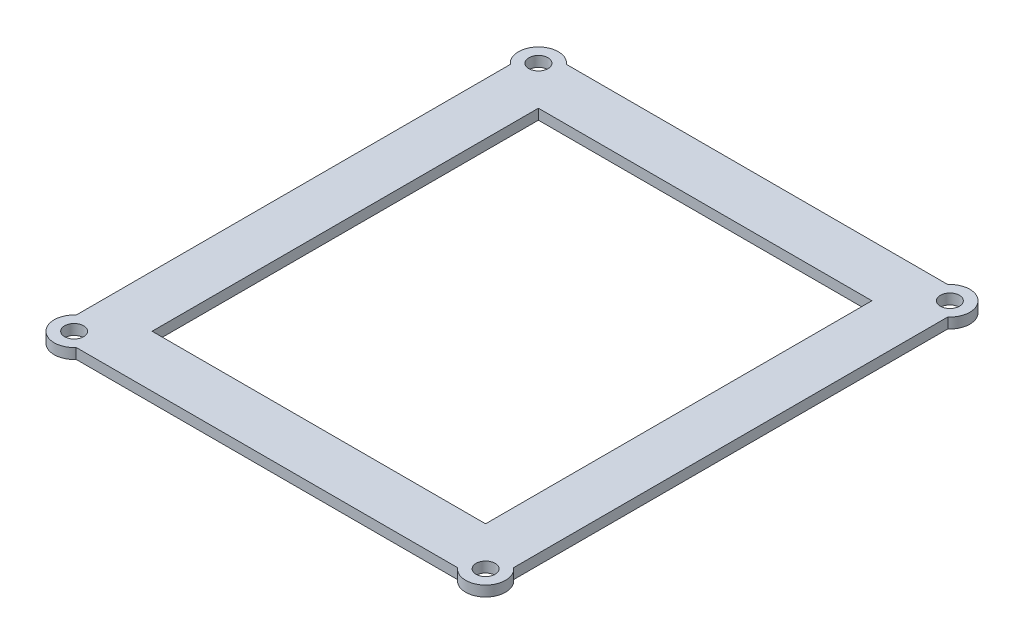
ISO-10303-21;
HEADER;
FILE_DESCRIPTION(('STEP AP214'),'2;1');
FILE_NAME('part.step','',(''),(''),'','','');
FILE_SCHEMA(('AUTOMOTIVE_DESIGN { 1 0 10303 214 1 1 1 1 }'));
ENDSEC;
DATA;
#1=APPLICATION_CONTEXT('core data for automotive mechanical design processes');
#2=APPLICATION_PROTOCOL_DEFINITION('international standard','automotive_design',2000,#1);
#3=PRODUCT_CONTEXT('',#1,'mechanical');
#4=PRODUCT('Part','Part','',(#3));
#5=PRODUCT_RELATED_PRODUCT_CATEGORY('part','',(#4));
#6=PRODUCT_DEFINITION_FORMATION('','',#4);
#7=PRODUCT_DEFINITION_CONTEXT('part definition',#1,'design');
#8=PRODUCT_DEFINITION('design','',#6,#7);
#9=PRODUCT_DEFINITION_SHAPE('','',#8);
#10=(LENGTH_UNIT() NAMED_UNIT(*) SI_UNIT(.MILLI.,.METRE.));
#11=(NAMED_UNIT(*) PLANE_ANGLE_UNIT() SI_UNIT($,.RADIAN.));
#12=(NAMED_UNIT(*) SI_UNIT($,.STERADIAN.) SOLID_ANGLE_UNIT());
#13=UNCERTAINTY_MEASURE_WITH_UNIT(LENGTH_MEASURE(1.E-05),#10,'distance_accuracy_value','');
#14=(GEOMETRIC_REPRESENTATION_CONTEXT(3) GLOBAL_UNCERTAINTY_ASSIGNED_CONTEXT((#13)) GLOBAL_UNIT_ASSIGNED_CONTEXT((#10,
#11,#12)) REPRESENTATION_CONTEXT('',''));
#15=CARTESIAN_POINT('',(0.,0.,0.));
#16=DIRECTION('',(0.,0.,1.));
#17=DIRECTION('',(1.,0.,0.));
#18=AXIS2_PLACEMENT_3D('',#15,#16,#17);
#19=CARTESIAN_POINT('',(0.,3.048,0.));
#20=DIRECTION('',(0.,-1.,0.));
#21=DIRECTION('',(0.,0.,-1.));
#22=AXIS2_PLACEMENT_3D('',#19,#20,#21);
#23=PLANE('',#22);
#24=DIRECTION('',(0.,0.,1.));
#25=VECTOR('',#24,1.);
#26=CARTESIAN_POINT('',(0.,3.048,0.));
#27=LINE('',#26,#25);
#28=CARTESIAN_POINT('',(0.,3.048,-135.525358673363));
#29=VERTEX_POINT('',#28);
#30=CARTESIAN_POINT('',(0.,3.048,-8.23864132663734));
#31=VERTEX_POINT('',#30);
#32=EDGE_CURVE('E130',#29,#31,#27,.T.);
#33=ORIENTED_EDGE('',*,*,#32,.T.);
#34=CARTESIAN_POINT('',(3.81,3.048,-3.81000000000001));
#35=DIRECTION('',(0.,1.,0.));
#36=DIRECTION('',(0.,0.,1.));
#37=AXIS2_PLACEMENT_3D('',#34,#35,#36);
#38=CIRCLE('',#37,5.842);
#39=CARTESIAN_POINT('',(8.23864132663732,3.048,0.));
#40=VERTEX_POINT('',#39);
#41=EDGE_CURVE('E48',#31,#40,#38,.T.);
#42=ORIENTED_EDGE('',*,*,#41,.T.);
#43=DIRECTION('',(1.,0.,0.));
#44=VECTOR('',#43,1.);
#45=CARTESIAN_POINT('',(0.,3.048,0.));
#46=LINE('',#45,#44);
#47=CARTESIAN_POINT('',(120.031358673363,3.048,0.));
#48=VERTEX_POINT('',#47);
#49=EDGE_CURVE('E138',#40,#48,#46,.T.);
#50=ORIENTED_EDGE('',*,*,#49,.T.);
#51=CARTESIAN_POINT('',(124.46,3.048,-3.81));
#52=DIRECTION('',(0.,1.,0.));
#53=DIRECTION('',(0.,0.,1.));
#54=AXIS2_PLACEMENT_3D('',#51,#52,#53);
#55=CIRCLE('',#54,5.84200000000001);
#56=CARTESIAN_POINT('',(128.27,3.048,-8.23864132663734));
#57=VERTEX_POINT('',#56);
#58=EDGE_CURVE('E54',#48,#57,#55,.T.);
#59=ORIENTED_EDGE('',*,*,#58,.T.);
#60=DIRECTION('',(0.,0.,-1.));
#61=VECTOR('',#60,1.);
#62=CARTESIAN_POINT('',(128.27,3.048,0.));
#63=LINE('',#62,#61);
#64=CARTESIAN_POINT('',(128.27,3.048,-135.525358673363));
#65=VERTEX_POINT('',#64);
#66=EDGE_CURVE('E141',#57,#65,#63,.T.);
#67=ORIENTED_EDGE('',*,*,#66,.T.);
#68=CARTESIAN_POINT('',(124.46,3.048,-139.954));
#69=DIRECTION('',(0.,1.,0.));
#70=DIRECTION('',(0.,0.,1.));
#71=AXIS2_PLACEMENT_3D('',#68,#69,#70);
#72=CIRCLE('',#71,5.84200000000001);
#73=CARTESIAN_POINT('',(120.031358673363,3.048,-143.764));
#74=VERTEX_POINT('',#73);
#75=EDGE_CURVE('E196',#65,#74,#72,.T.);
#76=ORIENTED_EDGE('',*,*,#75,.T.);
#77=DIRECTION('',(-1.,0.,0.));
#78=VECTOR('',#77,1.);
#79=CARTESIAN_POINT('',(0.,3.048,-143.764));
#80=LINE('',#79,#78);
#81=CARTESIAN_POINT('',(8.23864132663732,3.048,-143.764));
#82=VERTEX_POINT('',#81);
#83=EDGE_CURVE('E150',#74,#82,#80,.T.);
#84=ORIENTED_EDGE('',*,*,#83,.T.);
#85=CARTESIAN_POINT('',(3.81,3.048,-139.954));
#86=DIRECTION('',(0.,1.,0.));
#87=DIRECTION('',(0.,0.,1.));
#88=AXIS2_PLACEMENT_3D('',#85,#86,#87);
#89=CIRCLE('',#88,5.84200000000002);
#90=EDGE_CURVE('E137',#82,#29,#89,.T.);
#91=ORIENTED_EDGE('',*,*,#90,.T.);
#92=EDGE_LOOP('',(#33,#42,#50,#59,#67,#76,#84,#91));
#93=FACE_BOUND('',#92,.T.);
#94=DIRECTION('',(0.,0.,1.));
#95=VECTOR('',#94,1.);
#96=CARTESIAN_POINT('',(15.24,3.048,-15.24));
#97=LINE('',#96,#95);
#98=CARTESIAN_POINT('',(15.24,3.048,-128.524));
#99=VERTEX_POINT('',#98);
#100=CARTESIAN_POINT('',(15.24,3.048,-15.24));
#101=VERTEX_POINT('',#100);
#102=EDGE_CURVE('E220',#99,#101,#97,.T.);
#103=ORIENTED_EDGE('',*,*,#102,.F.);
#104=DIRECTION('',(-1.,0.,0.));
#105=VECTOR('',#104,1.);
#106=CARTESIAN_POINT('',(15.24,3.048,-128.524));
#107=LINE('',#106,#105);
#108=CARTESIAN_POINT('',(113.03,3.048,-128.524));
#109=VERTEX_POINT('',#108);
#110=EDGE_CURVE('E228',#109,#99,#107,.T.);
#111=ORIENTED_EDGE('',*,*,#110,.F.);
#112=DIRECTION('',(0.,0.,-1.));
#113=VECTOR('',#112,1.);
#114=CARTESIAN_POINT('',(113.03,3.048,-15.24));
#115=LINE('',#114,#113);
#116=CARTESIAN_POINT('',(113.03,3.048,-15.24));
#117=VERTEX_POINT('',#116);
#118=EDGE_CURVE('E225',#117,#109,#115,.T.);
#119=ORIENTED_EDGE('',*,*,#118,.F.);
#120=DIRECTION('',(1.,0.,0.));
#121=VECTOR('',#120,1.);
#122=CARTESIAN_POINT('',(15.24,3.048,-15.24));
#123=LINE('',#122,#121);
#124=EDGE_CURVE('E222',#101,#117,#123,.T.);
#125=ORIENTED_EDGE('',*,*,#124,.F.);
#126=EDGE_LOOP('',(#103,#111,#119,#125));
#127=FACE_BOUND('',#126,.T.);
#128=CARTESIAN_POINT('',(3.81,3.048,-139.954));
#129=DIRECTION('',(0.,1.,0.));
#130=DIRECTION('',(0.,0.,1.));
#131=AXIS2_PLACEMENT_3D('',#128,#129,#130);
#132=CIRCLE('',#131,2.79400000000001);
#133=CARTESIAN_POINT('',(3.81,3.048,-137.16));
#134=VERTEX_POINT('',#133);
#135=EDGE_CURVE('E161',#134,#134,#132,.T.);
#136=ORIENTED_EDGE('',*,*,#135,.F.);
#137=EDGE_LOOP('',(#136));
#138=FACE_BOUND('',#137,.T.);
#139=CARTESIAN_POINT('',(124.46,3.048,-139.954));
#140=DIRECTION('',(0.,1.,0.));
#141=DIRECTION('',(0.,0.,-1.));
#142=AXIS2_PLACEMENT_3D('',#139,#140,#141);
#143=CIRCLE('',#142,2.79399999999997);
#144=CARTESIAN_POINT('',(124.46,3.048,-137.16));
#145=VERTEX_POINT('',#144);
#146=EDGE_CURVE('E210',#145,#145,#143,.T.);
#147=ORIENTED_EDGE('',*,*,#146,.F.);
#148=EDGE_LOOP('',(#147));
#149=FACE_BOUND('',#148,.T.);
#150=CARTESIAN_POINT('',(124.46,3.048,-3.81));
#151=DIRECTION('',(0.,1.,0.));
#152=DIRECTION('',(0.,0.,1.));
#153=AXIS2_PLACEMENT_3D('',#150,#151,#152);
#154=CIRCLE('',#153,2.79399999999997);
#155=CARTESIAN_POINT('',(124.46,3.048,-1.01600000000003));
#156=VERTEX_POINT('',#155);
#157=EDGE_CURVE('E213',#156,#156,#154,.T.);
#158=ORIENTED_EDGE('',*,*,#157,.F.);
#159=EDGE_LOOP('',(#158));
#160=FACE_BOUND('',#159,.T.);
#161=CARTESIAN_POINT('',(3.81,3.048,-3.81000000000001));
#162=DIRECTION('',(0.,1.,0.));
#163=DIRECTION('',(0.,0.,-1.));
#164=AXIS2_PLACEMENT_3D('',#161,#162,#163);
#165=CIRCLE('',#164,2.794);
#166=CARTESIAN_POINT('',(3.81,3.048,-1.01600000000001));
#167=VERTEX_POINT('',#166);
#168=EDGE_CURVE('E209',#167,#167,#165,.T.);
#169=ORIENTED_EDGE('',*,*,#168,.F.);
#170=EDGE_LOOP('',(#169));
#171=FACE_BOUND('',#170,.T.);
#172=ADVANCED_FACE('F33',(#93,#127,#138,#149,#160,#171),#23,.F.);
#173=CARTESIAN_POINT('',(0.,0.,0.));
#174=DIRECTION('',(0.,-1.,0.));
#175=DIRECTION('',(0.,0.,-1.));
#176=AXIS2_PLACEMENT_3D('',#173,#174,#175);
#177=PLANE('',#176);
#178=DIRECTION('',(1.,0.,0.));
#179=VECTOR('',#178,1.);
#180=CARTESIAN_POINT('',(0.,0.,0.));
#181=LINE('',#180,#179);
#182=CARTESIAN_POINT('',(8.23864132663732,0.,0.));
#183=VERTEX_POINT('',#182);
#184=CARTESIAN_POINT('',(120.031358673363,0.,0.));
#185=VERTEX_POINT('',#184);
#186=EDGE_CURVE('E154',#183,#185,#181,.T.);
#187=ORIENTED_EDGE('',*,*,#186,.F.);
#188=CARTESIAN_POINT('',(3.81,0.,-3.81000000000001));
#189=DIRECTION('',(0.,1.,0.));
#190=DIRECTION('',(0.,0.,1.));
#191=AXIS2_PLACEMENT_3D('',#188,#189,#190);
#192=CIRCLE('',#191,5.842);
#193=CARTESIAN_POINT('',(0.,0.,-8.23864132663734));
#194=VERTEX_POINT('',#193);
#195=EDGE_CURVE('E124',#194,#183,#192,.T.);
#196=ORIENTED_EDGE('',*,*,#195,.F.);
#197=DIRECTION('',(0.,0.,1.));
#198=VECTOR('',#197,1.);
#199=CARTESIAN_POINT('',(0.,0.,0.));
#200=LINE('',#199,#198);
#201=CARTESIAN_POINT('',(0.,0.,-135.525358673363));
#202=VERTEX_POINT('',#201);
#203=EDGE_CURVE('E132',#202,#194,#200,.T.);
#204=ORIENTED_EDGE('',*,*,#203,.F.);
#205=CARTESIAN_POINT('',(3.81,0.,-139.954));
#206=DIRECTION('',(0.,1.,0.));
#207=DIRECTION('',(0.,0.,1.));
#208=AXIS2_PLACEMENT_3D('',#205,#206,#207);
#209=CIRCLE('',#208,5.84200000000002);
#210=CARTESIAN_POINT('',(8.23864132663732,0.,-143.764));
#211=VERTEX_POINT('',#210);
#212=EDGE_CURVE('E204',#211,#202,#209,.T.);
#213=ORIENTED_EDGE('',*,*,#212,.F.);
#214=DIRECTION('',(-1.,0.,0.));
#215=VECTOR('',#214,1.);
#216=CARTESIAN_POINT('',(0.,0.,-143.764));
#217=LINE('',#216,#215);
#218=CARTESIAN_POINT('',(120.031358673363,0.,-143.764));
#219=VERTEX_POINT('',#218);
#220=EDGE_CURVE('E139',#219,#211,#217,.T.);
#221=ORIENTED_EDGE('',*,*,#220,.F.);
#222=CARTESIAN_POINT('',(124.46,0.,-139.954));
#223=DIRECTION('',(0.,1.,0.));
#224=DIRECTION('',(0.,0.,1.));
#225=AXIS2_PLACEMENT_3D('',#222,#223,#224);
#226=CIRCLE('',#225,5.84200000000001);
#227=CARTESIAN_POINT('',(128.27,0.,-135.525358673363));
#228=VERTEX_POINT('',#227);
#229=EDGE_CURVE('E191',#228,#219,#226,.T.);
#230=ORIENTED_EDGE('',*,*,#229,.F.);
#231=DIRECTION('',(0.,0.,-1.));
#232=VECTOR('',#231,1.);
#233=CARTESIAN_POINT('',(128.27,0.,0.));
#234=LINE('',#233,#232);
#235=CARTESIAN_POINT('',(128.27,0.,-8.23864132663734));
#236=VERTEX_POINT('',#235);
#237=EDGE_CURVE('E143',#236,#228,#234,.T.);
#238=ORIENTED_EDGE('',*,*,#237,.F.);
#239=CARTESIAN_POINT('',(124.46,0.,-3.81));
#240=DIRECTION('',(0.,1.,0.));
#241=DIRECTION('',(0.,0.,1.));
#242=AXIS2_PLACEMENT_3D('',#239,#240,#241);
#243=CIRCLE('',#242,5.84200000000001);
#244=EDGE_CURVE('E189',#185,#236,#243,.T.);
#245=ORIENTED_EDGE('',*,*,#244,.F.);
#246=EDGE_LOOP('',(#187,#196,#204,#213,#221,#230,#238,#245));
#247=FACE_BOUND('',#246,.T.);
#248=DIRECTION('',(-1.,0.,0.));
#249=VECTOR('',#248,1.);
#250=CARTESIAN_POINT('',(15.24,0.,-128.524));
#251=LINE('',#250,#249);
#252=CARTESIAN_POINT('',(113.03,0.,-128.524));
#253=VERTEX_POINT('',#252);
#254=CARTESIAN_POINT('',(15.24,0.,-128.524));
#255=VERTEX_POINT('',#254);
#256=EDGE_CURVE('E223',#253,#255,#251,.T.);
#257=ORIENTED_EDGE('',*,*,#256,.T.);
#258=DIRECTION('',(0.,0.,1.));
#259=VECTOR('',#258,1.);
#260=CARTESIAN_POINT('',(15.24,0.,-15.24));
#261=LINE('',#260,#259);
#262=CARTESIAN_POINT('',(15.24,0.,-15.24));
#263=VERTEX_POINT('',#262);
#264=EDGE_CURVE('E170',#255,#263,#261,.T.);
#265=ORIENTED_EDGE('',*,*,#264,.T.);
#266=DIRECTION('',(1.,0.,0.));
#267=VECTOR('',#266,1.);
#268=CARTESIAN_POINT('',(15.24,0.,-15.24));
#269=LINE('',#268,#267);
#270=CARTESIAN_POINT('',(113.03,0.,-15.24));
#271=VERTEX_POINT('',#270);
#272=EDGE_CURVE('E233',#263,#271,#269,.T.);
#273=ORIENTED_EDGE('',*,*,#272,.T.);
#274=DIRECTION('',(0.,0.,-1.));
#275=VECTOR('',#274,1.);
#276=CARTESIAN_POINT('',(113.03,0.,-15.24));
#277=LINE('',#276,#275);
#278=EDGE_CURVE('E236',#271,#253,#277,.T.);
#279=ORIENTED_EDGE('',*,*,#278,.T.);
#280=EDGE_LOOP('',(#257,#265,#273,#279));
#281=FACE_BOUND('',#280,.T.);
#282=CARTESIAN_POINT('',(3.81,0.,-139.954));
#283=DIRECTION('',(0.,-1.,0.));
#284=DIRECTION('',(0.,0.,-1.));
#285=AXIS2_PLACEMENT_3D('',#282,#283,#284);
#286=CIRCLE('',#285,2.79400000000001);
#287=CARTESIAN_POINT('',(3.81,0.,-137.16));
#288=VERTEX_POINT('',#287);
#289=EDGE_CURVE('E157',#288,#288,#286,.T.);
#290=ORIENTED_EDGE('',*,*,#289,.F.);
#291=EDGE_LOOP('',(#290));
#292=FACE_BOUND('',#291,.T.);
#293=CARTESIAN_POINT('',(124.46,0.,-139.954));
#294=DIRECTION('',(0.,-1.,0.));
#295=DIRECTION('',(0.,0.,-1.));
#296=AXIS2_PLACEMENT_3D('',#293,#294,#295);
#297=CIRCLE('',#296,2.79399999999997);
#298=CARTESIAN_POINT('',(124.46,0.,-137.16));
#299=VERTEX_POINT('',#298);
#300=EDGE_CURVE('E160',#299,#299,#297,.T.);
#301=ORIENTED_EDGE('',*,*,#300,.F.);
#302=EDGE_LOOP('',(#301));
#303=FACE_BOUND('',#302,.T.);
#304=CARTESIAN_POINT('',(124.46,0.,-3.81));
#305=DIRECTION('',(0.,-1.,0.));
#306=DIRECTION('',(0.,0.,-1.));
#307=AXIS2_PLACEMENT_3D('',#304,#305,#306);
#308=CIRCLE('',#307,2.79399999999997);
#309=CARTESIAN_POINT('',(124.46,0.,-1.01600000000003));
#310=VERTEX_POINT('',#309);
#311=EDGE_CURVE('E164',#310,#310,#308,.T.);
#312=ORIENTED_EDGE('',*,*,#311,.F.);
#313=EDGE_LOOP('',(#312));
#314=FACE_BOUND('',#313,.T.);
#315=CARTESIAN_POINT('',(3.81,0.,-3.81000000000001));
#316=DIRECTION('',(0.,-1.,0.));
#317=DIRECTION('',(0.,0.,-1.));
#318=AXIS2_PLACEMENT_3D('',#315,#316,#317);
#319=CIRCLE('',#318,2.794);
#320=CARTESIAN_POINT('',(3.81,0.,-1.01600000000001));
#321=VERTEX_POINT('',#320);
#322=EDGE_CURVE('E167',#321,#321,#319,.T.);
#323=ORIENTED_EDGE('',*,*,#322,.F.);
#324=EDGE_LOOP('',(#323));
#325=FACE_BOUND('',#324,.T.);
#326=ADVANCED_FACE('F187',(#247,#281,#292,#303,#314,#325),#177,.T.);
#327=CARTESIAN_POINT('',(0.,3.048,0.));
#328=DIRECTION('',(1.,0.,0.));
#329=DIRECTION('',(0.,0.,-1.));
#330=AXIS2_PLACEMENT_3D('',#327,#328,#329);
#331=PLANE('',#330);
#332=ORIENTED_EDGE('',*,*,#203,.T.);
#333=DIRECTION('',(0.,1.,0.));
#334=VECTOR('',#333,1.);
#335=CARTESIAN_POINT('',(0.,0.,-8.23864132663734));
#336=LINE('',#335,#334);
#337=EDGE_CURVE('E121',#194,#31,#336,.T.);
#338=ORIENTED_EDGE('',*,*,#337,.T.);
#339=ORIENTED_EDGE('',*,*,#32,.F.);
#340=DIRECTION('',(0.,1.,0.));
#341=VECTOR('',#340,1.);
#342=CARTESIAN_POINT('',(0.,0.,-135.525358673363));
#343=LINE('',#342,#341);
#344=EDGE_CURVE('E206',#29,#202,#343,.F.);
#345=ORIENTED_EDGE('',*,*,#344,.T.);
#346=EDGE_LOOP('',(#332,#338,#339,#345));
#347=FACE_BOUND('',#346,.T.);
#348=ADVANCED_FACE('F35',(#347),#331,.F.);
#349=CARTESIAN_POINT('',(0.,3.048,0.));
#350=DIRECTION('',(0.,0.,-1.));
#351=DIRECTION('',(-1.,0.,0.));
#352=AXIS2_PLACEMENT_3D('',#349,#350,#351);
#353=PLANE('',#352);
#354=ORIENTED_EDGE('',*,*,#49,.F.);
#355=DIRECTION('',(0.,1.,0.));
#356=VECTOR('',#355,1.);
#357=CARTESIAN_POINT('',(8.23864132663732,0.,0.));
#358=LINE('',#357,#356);
#359=EDGE_CURVE('E11',#40,#183,#358,.F.);
#360=ORIENTED_EDGE('',*,*,#359,.T.);
#361=ORIENTED_EDGE('',*,*,#186,.T.);
#362=DIRECTION('',(0.,1.,0.));
#363=VECTOR('',#362,1.);
#364=CARTESIAN_POINT('',(120.031358673363,0.,0.));
#365=LINE('',#364,#363);
#366=EDGE_CURVE('E199',#185,#48,#365,.T.);
#367=ORIENTED_EDGE('',*,*,#366,.T.);
#368=EDGE_LOOP('',(#354,#360,#361,#367));
#369=FACE_BOUND('',#368,.T.);
#370=ADVANCED_FACE('F287',(#369),#353,.F.);
#371=CARTESIAN_POINT('',(128.27,3.048,0.));
#372=DIRECTION('',(-1.,0.,0.));
#373=DIRECTION('',(0.,0.,1.));
#374=AXIS2_PLACEMENT_3D('',#371,#372,#373);
#375=PLANE('',#374);
#376=ORIENTED_EDGE('',*,*,#66,.F.);
#377=DIRECTION('',(0.,1.,0.));
#378=VECTOR('',#377,1.);
#379=CARTESIAN_POINT('',(128.27,0.,-8.23864132663734));
#380=LINE('',#379,#378);
#381=EDGE_CURVE('E41',#57,#236,#380,.F.);
#382=ORIENTED_EDGE('',*,*,#381,.T.);
#383=ORIENTED_EDGE('',*,*,#237,.T.);
#384=DIRECTION('',(0.,1.,0.));
#385=VECTOR('',#384,1.);
#386=CARTESIAN_POINT('',(128.27,0.,-135.525358673363));
#387=LINE('',#386,#385);
#388=EDGE_CURVE('E195',#228,#65,#387,.T.);
#389=ORIENTED_EDGE('',*,*,#388,.T.);
#390=EDGE_LOOP('',(#376,#382,#383,#389));
#391=FACE_BOUND('',#390,.T.);
#392=ADVANCED_FACE('F179',(#391),#375,.F.);
#393=CARTESIAN_POINT('',(0.,3.048,-143.764));
#394=DIRECTION('',(0.,0.,1.));
#395=DIRECTION('',(1.,0.,0.));
#396=AXIS2_PLACEMENT_3D('',#393,#394,#395);
#397=PLANE('',#396);
#398=ORIENTED_EDGE('',*,*,#83,.F.);
#399=DIRECTION('',(0.,1.,0.));
#400=VECTOR('',#399,1.);
#401=CARTESIAN_POINT('',(120.031358673363,0.,-143.764));
#402=LINE('',#401,#400);
#403=EDGE_CURVE('E173',#74,#219,#402,.F.);
#404=ORIENTED_EDGE('',*,*,#403,.T.);
#405=ORIENTED_EDGE('',*,*,#220,.T.);
#406=DIRECTION('',(0.,1.,0.));
#407=VECTOR('',#406,1.);
#408=CARTESIAN_POINT('',(8.23864132663732,0.,-143.764));
#409=LINE('',#408,#407);
#410=EDGE_CURVE('E152',#211,#82,#409,.T.);
#411=ORIENTED_EDGE('',*,*,#410,.T.);
#412=EDGE_LOOP('',(#398,#404,#405,#411));
#413=FACE_BOUND('',#412,.T.);
#414=ADVANCED_FACE('F282',(#413),#397,.F.);
#415=CARTESIAN_POINT('',(15.24,3.048,-15.24));
#416=DIRECTION('',(1.,0.,0.));
#417=DIRECTION('',(0.,0.,-1.));
#418=AXIS2_PLACEMENT_3D('',#415,#416,#417);
#419=PLANE('',#418);
#420=ORIENTED_EDGE('',*,*,#264,.F.);
#421=DIRECTION('',(0.,-1.,0.));
#422=VECTOR('',#421,1.);
#423=CARTESIAN_POINT('',(15.24,3.048,-128.524));
#424=LINE('',#423,#422);
#425=EDGE_CURVE('E230',#99,#255,#424,.T.);
#426=ORIENTED_EDGE('',*,*,#425,.F.);
#427=ORIENTED_EDGE('',*,*,#102,.T.);
#428=DIRECTION('',(0.,-1.,0.));
#429=VECTOR('',#428,1.);
#430=CARTESIAN_POINT('',(15.24,3.048,-15.24));
#431=LINE('',#430,#429);
#432=EDGE_CURVE('E146',#101,#263,#431,.T.);
#433=ORIENTED_EDGE('',*,*,#432,.T.);
#434=EDGE_LOOP('',(#420,#426,#427,#433));
#435=FACE_BOUND('',#434,.T.);
#436=ADVANCED_FACE('F251',(#435),#419,.T.);
#437=CARTESIAN_POINT('',(15.24,3.048,-15.24));
#438=DIRECTION('',(0.,0.,-1.));
#439=DIRECTION('',(-1.,0.,0.));
#440=AXIS2_PLACEMENT_3D('',#437,#438,#439);
#441=PLANE('',#440);
#442=ORIENTED_EDGE('',*,*,#272,.F.);
#443=ORIENTED_EDGE('',*,*,#432,.F.);
#444=ORIENTED_EDGE('',*,*,#124,.T.);
#445=DIRECTION('',(0.,-1.,0.));
#446=VECTOR('',#445,1.);
#447=CARTESIAN_POINT('',(113.03,3.048,-15.24));
#448=LINE('',#447,#446);
#449=EDGE_CURVE('E244',#117,#271,#448,.T.);
#450=ORIENTED_EDGE('',*,*,#449,.T.);
#451=EDGE_LOOP('',(#442,#443,#444,#450));
#452=FACE_BOUND('',#451,.T.);
#453=ADVANCED_FACE('F262',(#452),#441,.T.);
#454=CARTESIAN_POINT('',(113.03,3.048,-15.24));
#455=DIRECTION('',(-1.,0.,0.));
#456=DIRECTION('',(0.,0.,1.));
#457=AXIS2_PLACEMENT_3D('',#454,#455,#456);
#458=PLANE('',#457);
#459=ORIENTED_EDGE('',*,*,#278,.F.);
#460=ORIENTED_EDGE('',*,*,#449,.F.);
#461=ORIENTED_EDGE('',*,*,#118,.T.);
#462=DIRECTION('',(0.,-1.,0.));
#463=VECTOR('',#462,1.);
#464=CARTESIAN_POINT('',(113.03,3.048,-128.524));
#465=LINE('',#464,#463);
#466=EDGE_CURVE('E243',#109,#253,#465,.T.);
#467=ORIENTED_EDGE('',*,*,#466,.T.);
#468=EDGE_LOOP('',(#459,#460,#461,#467));
#469=FACE_BOUND('',#468,.T.);
#470=ADVANCED_FACE('F264',(#469),#458,.T.);
#471=CARTESIAN_POINT('',(15.24,3.048,-128.524));
#472=DIRECTION('',(0.,0.,1.));
#473=DIRECTION('',(1.,0.,0.));
#474=AXIS2_PLACEMENT_3D('',#471,#472,#473);
#475=PLANE('',#474);
#476=ORIENTED_EDGE('',*,*,#256,.F.);
#477=ORIENTED_EDGE('',*,*,#466,.F.);
#478=ORIENTED_EDGE('',*,*,#110,.T.);
#479=ORIENTED_EDGE('',*,*,#425,.T.);
#480=EDGE_LOOP('',(#476,#477,#478,#479));
#481=FACE_BOUND('',#480,.T.);
#482=ADVANCED_FACE('F258',(#481),#475,.T.);
#483=CARTESIAN_POINT('',(3.81,-0.254,-139.954));
#484=DIRECTION('',(0.,1.,0.));
#485=DIRECTION('',(0.,0.,1.));
#486=AXIS2_PLACEMENT_3D('',#483,#484,#485);
#487=CYLINDRICAL_SURFACE('',#486,2.79400000000001);
#488=CARTESIAN_POINT('',(3.81,0.,-137.16));
#489=CARTESIAN_POINT('',(3.81,0.0317500000000001,-137.16));
#490=CARTESIAN_POINT('',(3.81,0.0635000000000001,-137.16));
#491=CARTESIAN_POINT('',(3.81,0.127,-137.16));
#492=CARTESIAN_POINT('',(3.81,0.15875,-137.16));
#493=CARTESIAN_POINT('',(3.81,0.22225,-137.16));
#494=CARTESIAN_POINT('',(3.81,0.254,-137.16));
#495=CARTESIAN_POINT('',(3.81,0.3175,-137.16));
#496=CARTESIAN_POINT('',(3.81,0.34925,-137.16));
#497=CARTESIAN_POINT('',(3.81,0.41275,-137.16));
#498=CARTESIAN_POINT('',(3.81,0.4445,-137.16));
#499=CARTESIAN_POINT('',(3.81,0.508,-137.16));
#500=CARTESIAN_POINT('',(3.81,0.53975,-137.16));
#501=CARTESIAN_POINT('',(3.81,0.60325,-137.16));
#502=CARTESIAN_POINT('',(3.81,0.635,-137.16));
#503=CARTESIAN_POINT('',(3.81,0.6985,-137.16));
#504=CARTESIAN_POINT('',(3.81,0.73025,-137.16));
#505=CARTESIAN_POINT('',(3.81,0.79375,-137.16));
#506=CARTESIAN_POINT('',(3.81,0.8255,-137.16));
#507=CARTESIAN_POINT('',(3.81,0.889,-137.16));
#508=CARTESIAN_POINT('',(3.81,0.92075,-137.16));
#509=CARTESIAN_POINT('',(3.81,0.98425,-137.16));
#510=CARTESIAN_POINT('',(3.81,1.016,-137.16));
#511=CARTESIAN_POINT('',(3.81,1.0795,-137.16));
#512=CARTESIAN_POINT('',(3.81,1.11125,-137.16));
#513=CARTESIAN_POINT('',(3.81,1.17475,-137.16));
#514=CARTESIAN_POINT('',(3.81,1.2065,-137.16));
#515=CARTESIAN_POINT('',(3.81,1.27,-137.16));
#516=CARTESIAN_POINT('',(3.81,1.30175,-137.16));
#517=CARTESIAN_POINT('',(3.81,1.36525,-137.16));
#518=CARTESIAN_POINT('',(3.81,1.397,-137.16));
#519=CARTESIAN_POINT('',(3.81,1.4605,-137.16));
#520=CARTESIAN_POINT('',(3.81,1.49225,-137.16));
#521=CARTESIAN_POINT('',(3.81,1.55575,-137.16));
#522=CARTESIAN_POINT('',(3.81,1.5875,-137.16));
#523=CARTESIAN_POINT('',(3.81,1.651,-137.16));
#524=CARTESIAN_POINT('',(3.81,1.68275,-137.16));
#525=CARTESIAN_POINT('',(3.81,1.74625,-137.16));
#526=CARTESIAN_POINT('',(3.81,1.778,-137.16));
#527=CARTESIAN_POINT('',(3.81,1.8415,-137.16));
#528=CARTESIAN_POINT('',(3.81,1.87325,-137.16));
#529=CARTESIAN_POINT('',(3.81,1.93675,-137.16));
#530=CARTESIAN_POINT('',(3.81,1.9685,-137.16));
#531=CARTESIAN_POINT('',(3.81,2.032,-137.16));
#532=CARTESIAN_POINT('',(3.81,2.06375,-137.16));
#533=CARTESIAN_POINT('',(3.81,2.12725,-137.16));
#534=CARTESIAN_POINT('',(3.81,2.159,-137.16));
#535=CARTESIAN_POINT('',(3.81,2.2225,-137.16));
#536=CARTESIAN_POINT('',(3.81,2.25425,-137.16));
#537=CARTESIAN_POINT('',(3.81,2.31775,-137.16));
#538=CARTESIAN_POINT('',(3.81,2.3495,-137.16));
#539=CARTESIAN_POINT('',(3.81,2.413,-137.16));
#540=CARTESIAN_POINT('',(3.81,2.44475,-137.16));
#541=CARTESIAN_POINT('',(3.81,2.50825,-137.16));
#542=CARTESIAN_POINT('',(3.81,2.54,-137.16));
#543=CARTESIAN_POINT('',(3.81,2.6035,-137.16));
#544=CARTESIAN_POINT('',(3.81,2.63525,-137.16));
#545=CARTESIAN_POINT('',(3.81,2.69875,-137.16));
#546=CARTESIAN_POINT('',(3.81,2.7305,-137.16));
#547=CARTESIAN_POINT('',(3.81,2.794,-137.16));
#548=CARTESIAN_POINT('',(3.81,2.82575,-137.16));
#549=CARTESIAN_POINT('',(3.81,2.88925,-137.16));
#550=CARTESIAN_POINT('',(3.81,2.921,-137.16));
#551=CARTESIAN_POINT('',(3.81,2.9845,-137.16));
#552=CARTESIAN_POINT('',(3.81,3.01625,-137.16));
#553=CARTESIAN_POINT('',(3.81,3.048,-137.16));
#554=B_SPLINE_CURVE_WITH_KNOTS('',3,(#488,#489,#490,#491,#492,#493,#494,#495,#496,#497,#498,
#499,#500,#501,#502,#503,#504,#505,#506,#507,#508,#509,#510,#511,#512,#513,#514,#515,#516,#517,
#518,#519,#520,#521,#522,#523,#524,#525,#526,#527,#528,#529,#530,#531,#532,#533,#534,#535,#536,
#537,#538,#539,#540,#541,#542,#543,#544,#545,#546,#547,#548,#549,#550,#551,#552,#553),
.UNSPECIFIED.,.F.,.F.,(4,2,2,2,2,2,2,2,2,2,2,2,2,2,2,2,2,2,2,2,2,2,2,2,2,2,2,2,2,2,2,2,4),(0.,
0.09525,0.1905,0.28575,0.381,0.47625,0.5715,0.66675,0.762,0.85725,0.9525,1.04775,1.143,1.23825,
1.3335,1.42875,1.524,1.61925,1.7145,1.80975,1.905,2.00025,2.0955,2.19075,2.286,2.38125,2.4765,
2.57175,2.667,2.76225,2.8575,2.95275,3.048),.UNSPECIFIED.);
#555=EDGE_CURVE('BSEAM271',#288,#134,#554,.T.);
#556=ORIENTED_EDGE('',*,*,#289,.T.);
#557=ORIENTED_EDGE('',*,*,#135,.T.);
#558=ORIENTED_EDGE('',*,*,#555,.T.);
#559=ORIENTED_EDGE('',*,*,#555,.F.);
#560=EDGE_LOOP('',(#556,#558,#557,#559));
#561=FACE_BOUND('',#560,.T.);
#562=ADVANCED_FACE('F271',(#561),#487,.F.);
#563=CARTESIAN_POINT('',(124.46,-0.254,-139.954));
#564=DIRECTION('',(0.,1.,0.));
#565=DIRECTION('',(0.,0.,1.));
#566=AXIS2_PLACEMENT_3D('',#563,#564,#565);
#567=CYLINDRICAL_SURFACE('',#566,2.79399999999997);
#568=CARTESIAN_POINT('',(124.46,0.,-137.16));
#569=CARTESIAN_POINT('',(124.46,0.0317500000000001,-137.16));
#570=CARTESIAN_POINT('',(124.46,0.0635000000000001,-137.16));
#571=CARTESIAN_POINT('',(124.46,0.127,-137.16));
#572=CARTESIAN_POINT('',(124.46,0.15875,-137.16));
#573=CARTESIAN_POINT('',(124.46,0.22225,-137.16));
#574=CARTESIAN_POINT('',(124.46,0.254,-137.16));
#575=CARTESIAN_POINT('',(124.46,0.3175,-137.16));
#576=CARTESIAN_POINT('',(124.46,0.34925,-137.16));
#577=CARTESIAN_POINT('',(124.46,0.41275,-137.16));
#578=CARTESIAN_POINT('',(124.46,0.4445,-137.16));
#579=CARTESIAN_POINT('',(124.46,0.508,-137.16));
#580=CARTESIAN_POINT('',(124.46,0.53975,-137.16));
#581=CARTESIAN_POINT('',(124.46,0.60325,-137.16));
#582=CARTESIAN_POINT('',(124.46,0.635,-137.16));
#583=CARTESIAN_POINT('',(124.46,0.6985,-137.16));
#584=CARTESIAN_POINT('',(124.46,0.73025,-137.16));
#585=CARTESIAN_POINT('',(124.46,0.79375,-137.16));
#586=CARTESIAN_POINT('',(124.46,0.8255,-137.16));
#587=CARTESIAN_POINT('',(124.46,0.889,-137.16));
#588=CARTESIAN_POINT('',(124.46,0.92075,-137.16));
#589=CARTESIAN_POINT('',(124.46,0.98425,-137.16));
#590=CARTESIAN_POINT('',(124.46,1.016,-137.16));
#591=CARTESIAN_POINT('',(124.46,1.0795,-137.16));
#592=CARTESIAN_POINT('',(124.46,1.11125,-137.16));
#593=CARTESIAN_POINT('',(124.46,1.17475,-137.16));
#594=CARTESIAN_POINT('',(124.46,1.2065,-137.16));
#595=CARTESIAN_POINT('',(124.46,1.27,-137.16));
#596=CARTESIAN_POINT('',(124.46,1.30175,-137.16));
#597=CARTESIAN_POINT('',(124.46,1.36525,-137.16));
#598=CARTESIAN_POINT('',(124.46,1.397,-137.16));
#599=CARTESIAN_POINT('',(124.46,1.4605,-137.16));
#600=CARTESIAN_POINT('',(124.46,1.49225,-137.16));
#601=CARTESIAN_POINT('',(124.46,1.55575,-137.16));
#602=CARTESIAN_POINT('',(124.46,1.5875,-137.16));
#603=CARTESIAN_POINT('',(124.46,1.651,-137.16));
#604=CARTESIAN_POINT('',(124.46,1.68275,-137.16));
#605=CARTESIAN_POINT('',(124.46,1.74625,-137.16));
#606=CARTESIAN_POINT('',(124.46,1.778,-137.16));
#607=CARTESIAN_POINT('',(124.46,1.8415,-137.16));
#608=CARTESIAN_POINT('',(124.46,1.87325,-137.16));
#609=CARTESIAN_POINT('',(124.46,1.93675,-137.16));
#610=CARTESIAN_POINT('',(124.46,1.9685,-137.16));
#611=CARTESIAN_POINT('',(124.46,2.032,-137.16));
#612=CARTESIAN_POINT('',(124.46,2.06375,-137.16));
#613=CARTESIAN_POINT('',(124.46,2.12725,-137.16));
#614=CARTESIAN_POINT('',(124.46,2.159,-137.16));
#615=CARTESIAN_POINT('',(124.46,2.2225,-137.16));
#616=CARTESIAN_POINT('',(124.46,2.25425,-137.16));
#617=CARTESIAN_POINT('',(124.46,2.31775,-137.16));
#618=CARTESIAN_POINT('',(124.46,2.3495,-137.16));
#619=CARTESIAN_POINT('',(124.46,2.413,-137.16));
#620=CARTESIAN_POINT('',(124.46,2.44475,-137.16));
#621=CARTESIAN_POINT('',(124.46,2.50825,-137.16));
#622=CARTESIAN_POINT('',(124.46,2.54,-137.16));
#623=CARTESIAN_POINT('',(124.46,2.6035,-137.16));
#624=CARTESIAN_POINT('',(124.46,2.63525,-137.16));
#625=CARTESIAN_POINT('',(124.46,2.69875,-137.16));
#626=CARTESIAN_POINT('',(124.46,2.7305,-137.16));
#627=CARTESIAN_POINT('',(124.46,2.794,-137.16));
#628=CARTESIAN_POINT('',(124.46,2.82575,-137.16));
#629=CARTESIAN_POINT('',(124.46,2.88925,-137.16));
#630=CARTESIAN_POINT('',(124.46,2.921,-137.16));
#631=CARTESIAN_POINT('',(124.46,2.9845,-137.16));
#632=CARTESIAN_POINT('',(124.46,3.01625,-137.16));
#633=CARTESIAN_POINT('',(124.46,3.048,-137.16));
#634=B_SPLINE_CURVE_WITH_KNOTS('',3,(#568,#569,#570,#571,#572,#573,#574,#575,#576,#577,#578,
#579,#580,#581,#582,#583,#584,#585,#586,#587,#588,#589,#590,#591,#592,#593,#594,#595,#596,#597,
#598,#599,#600,#601,#602,#603,#604,#605,#606,#607,#608,#609,#610,#611,#612,#613,#614,#615,#616,
#617,#618,#619,#620,#621,#622,#623,#624,#625,#626,#627,#628,#629,#630,#631,#632,#633),
.UNSPECIFIED.,.F.,.F.,(4,2,2,2,2,2,2,2,2,2,2,2,2,2,2,2,2,2,2,2,2,2,2,2,2,2,2,2,2,2,2,2,4),(0.,
0.09525,0.1905,0.28575,0.381,0.47625,0.5715,0.66675,0.762,0.85725,0.9525,1.04775,1.143,1.23825,
1.3335,1.42875,1.524,1.61925,1.7145,1.80975,1.905,2.00025,2.0955,2.19075,2.286,2.38125,2.4765,
2.57175,2.667,2.76225,2.8575,2.95275,3.048),.UNSPECIFIED.);
#635=EDGE_CURVE('BSEAM315',#299,#145,#634,.T.);
#636=ORIENTED_EDGE('',*,*,#300,.T.);
#637=ORIENTED_EDGE('',*,*,#146,.T.);
#638=ORIENTED_EDGE('',*,*,#635,.T.);
#639=ORIENTED_EDGE('',*,*,#635,.F.);
#640=EDGE_LOOP('',(#636,#638,#637,#639));
#641=FACE_BOUND('',#640,.T.);
#642=ADVANCED_FACE('F315',(#641),#567,.F.);
#643=CARTESIAN_POINT('',(124.46,-0.254,-3.81));
#644=DIRECTION('',(0.,1.,0.));
#645=DIRECTION('',(0.,0.,1.));
#646=AXIS2_PLACEMENT_3D('',#643,#644,#645);
#647=CYLINDRICAL_SURFACE('',#646,2.79399999999997);
#648=CARTESIAN_POINT('',(124.46,0.,-1.01600000000003));
#649=CARTESIAN_POINT('',(124.46,0.0317500000000001,-1.01600000000003));
#650=CARTESIAN_POINT('',(124.46,0.0635000000000001,-1.01600000000003));
#651=CARTESIAN_POINT('',(124.46,0.127,-1.01600000000003));
#652=CARTESIAN_POINT('',(124.46,0.15875,-1.01600000000003));
#653=CARTESIAN_POINT('',(124.46,0.22225,-1.01600000000003));
#654=CARTESIAN_POINT('',(124.46,0.254,-1.01600000000003));
#655=CARTESIAN_POINT('',(124.46,0.3175,-1.01600000000003));
#656=CARTESIAN_POINT('',(124.46,0.34925,-1.01600000000003));
#657=CARTESIAN_POINT('',(124.46,0.41275,-1.01600000000003));
#658=CARTESIAN_POINT('',(124.46,0.4445,-1.01600000000003));
#659=CARTESIAN_POINT('',(124.46,0.508,-1.01600000000003));
#660=CARTESIAN_POINT('',(124.46,0.53975,-1.01600000000003));
#661=CARTESIAN_POINT('',(124.46,0.60325,-1.01600000000003));
#662=CARTESIAN_POINT('',(124.46,0.635,-1.01600000000003));
#663=CARTESIAN_POINT('',(124.46,0.6985,-1.01600000000003));
#664=CARTESIAN_POINT('',(124.46,0.73025,-1.01600000000003));
#665=CARTESIAN_POINT('',(124.46,0.79375,-1.01600000000003));
#666=CARTESIAN_POINT('',(124.46,0.8255,-1.01600000000003));
#667=CARTESIAN_POINT('',(124.46,0.889,-1.01600000000003));
#668=CARTESIAN_POINT('',(124.46,0.92075,-1.01600000000003));
#669=CARTESIAN_POINT('',(124.46,0.98425,-1.01600000000003));
#670=CARTESIAN_POINT('',(124.46,1.016,-1.01600000000003));
#671=CARTESIAN_POINT('',(124.46,1.0795,-1.01600000000003));
#672=CARTESIAN_POINT('',(124.46,1.11125,-1.01600000000003));
#673=CARTESIAN_POINT('',(124.46,1.17475,-1.01600000000003));
#674=CARTESIAN_POINT('',(124.46,1.2065,-1.01600000000003));
#675=CARTESIAN_POINT('',(124.46,1.27,-1.01600000000003));
#676=CARTESIAN_POINT('',(124.46,1.30175,-1.01600000000003));
#677=CARTESIAN_POINT('',(124.46,1.36525,-1.01600000000003));
#678=CARTESIAN_POINT('',(124.46,1.397,-1.01600000000003));
#679=CARTESIAN_POINT('',(124.46,1.4605,-1.01600000000003));
#680=CARTESIAN_POINT('',(124.46,1.49225,-1.01600000000003));
#681=CARTESIAN_POINT('',(124.46,1.55575,-1.01600000000003));
#682=CARTESIAN_POINT('',(124.46,1.5875,-1.01600000000003));
#683=CARTESIAN_POINT('',(124.46,1.651,-1.01600000000003));
#684=CARTESIAN_POINT('',(124.46,1.68275,-1.01600000000003));
#685=CARTESIAN_POINT('',(124.46,1.74625,-1.01600000000003));
#686=CARTESIAN_POINT('',(124.46,1.778,-1.01600000000003));
#687=CARTESIAN_POINT('',(124.46,1.8415,-1.01600000000003));
#688=CARTESIAN_POINT('',(124.46,1.87325,-1.01600000000003));
#689=CARTESIAN_POINT('',(124.46,1.93675,-1.01600000000003));
#690=CARTESIAN_POINT('',(124.46,1.9685,-1.01600000000003));
#691=CARTESIAN_POINT('',(124.46,2.032,-1.01600000000003));
#692=CARTESIAN_POINT('',(124.46,2.06375,-1.01600000000003));
#693=CARTESIAN_POINT('',(124.46,2.12725,-1.01600000000003));
#694=CARTESIAN_POINT('',(124.46,2.159,-1.01600000000003));
#695=CARTESIAN_POINT('',(124.46,2.2225,-1.01600000000003));
#696=CARTESIAN_POINT('',(124.46,2.25425,-1.01600000000003));
#697=CARTESIAN_POINT('',(124.46,2.31775,-1.01600000000003));
#698=CARTESIAN_POINT('',(124.46,2.3495,-1.01600000000003));
#699=CARTESIAN_POINT('',(124.46,2.413,-1.01600000000003));
#700=CARTESIAN_POINT('',(124.46,2.44475,-1.01600000000003));
#701=CARTESIAN_POINT('',(124.46,2.50825,-1.01600000000003));
#702=CARTESIAN_POINT('',(124.46,2.54,-1.01600000000003));
#703=CARTESIAN_POINT('',(124.46,2.6035,-1.01600000000003));
#704=CARTESIAN_POINT('',(124.46,2.63525,-1.01600000000003));
#705=CARTESIAN_POINT('',(124.46,2.69875,-1.01600000000003));
#706=CARTESIAN_POINT('',(124.46,2.7305,-1.01600000000003));
#707=CARTESIAN_POINT('',(124.46,2.794,-1.01600000000003));
#708=CARTESIAN_POINT('',(124.46,2.82575,-1.01600000000003));
#709=CARTESIAN_POINT('',(124.46,2.88925,-1.01600000000003));
#710=CARTESIAN_POINT('',(124.46,2.921,-1.01600000000003));
#711=CARTESIAN_POINT('',(124.46,2.9845,-1.01600000000003));
#712=CARTESIAN_POINT('',(124.46,3.01625,-1.01600000000003));
#713=CARTESIAN_POINT('',(124.46,3.048,-1.01600000000003));
#714=B_SPLINE_CURVE_WITH_KNOTS('',3,(#648,#649,#650,#651,#652,#653,#654,#655,#656,#657,#658,
#659,#660,#661,#662,#663,#664,#665,#666,#667,#668,#669,#670,#671,#672,#673,#674,#675,#676,#677,
#678,#679,#680,#681,#682,#683,#684,#685,#686,#687,#688,#689,#690,#691,#692,#693,#694,#695,#696,
#697,#698,#699,#700,#701,#702,#703,#704,#705,#706,#707,#708,#709,#710,#711,#712,#713),
.UNSPECIFIED.,.F.,.F.,(4,2,2,2,2,2,2,2,2,2,2,2,2,2,2,2,2,2,2,2,2,2,2,2,2,2,2,2,2,2,2,2,4),(0.,
0.09525,0.1905,0.28575,0.381,0.47625,0.5715,0.66675,0.762,0.85725,0.9525,1.04775,1.143,1.23825,
1.3335,1.42875,1.524,1.61925,1.7145,1.80975,1.905,2.00025,2.0955,2.19075,2.286,2.38125,2.4765,
2.57175,2.667,2.76225,2.8575,2.95275,3.048),.UNSPECIFIED.);
#715=EDGE_CURVE('BSEAM318',#310,#156,#714,.T.);
#716=ORIENTED_EDGE('',*,*,#311,.T.);
#717=ORIENTED_EDGE('',*,*,#157,.T.);
#718=ORIENTED_EDGE('',*,*,#715,.T.);
#719=ORIENTED_EDGE('',*,*,#715,.F.);
#720=EDGE_LOOP('',(#716,#718,#717,#719));
#721=FACE_BOUND('',#720,.T.);
#722=ADVANCED_FACE('F318',(#721),#647,.F.);
#723=CARTESIAN_POINT('',(3.81,-0.254,-3.81000000000001));
#724=DIRECTION('',(0.,1.,0.));
#725=DIRECTION('',(0.,0.,1.));
#726=AXIS2_PLACEMENT_3D('',#723,#724,#725);
#727=CYLINDRICAL_SURFACE('',#726,2.794);
#728=CARTESIAN_POINT('',(3.81,0.,-1.01600000000001));
#729=CARTESIAN_POINT('',(3.81,0.0317500000000001,-1.01600000000001));
#730=CARTESIAN_POINT('',(3.81,0.0635000000000001,-1.01600000000001));
#731=CARTESIAN_POINT('',(3.81,0.127,-1.01600000000001));
#732=CARTESIAN_POINT('',(3.81,0.15875,-1.01600000000001));
#733=CARTESIAN_POINT('',(3.81,0.22225,-1.01600000000001));
#734=CARTESIAN_POINT('',(3.81,0.254,-1.01600000000001));
#735=CARTESIAN_POINT('',(3.81,0.3175,-1.01600000000001));
#736=CARTESIAN_POINT('',(3.81,0.34925,-1.01600000000001));
#737=CARTESIAN_POINT('',(3.81,0.41275,-1.01600000000001));
#738=CARTESIAN_POINT('',(3.81,0.4445,-1.01600000000001));
#739=CARTESIAN_POINT('',(3.81,0.508,-1.01600000000001));
#740=CARTESIAN_POINT('',(3.81,0.53975,-1.01600000000001));
#741=CARTESIAN_POINT('',(3.81,0.60325,-1.01600000000001));
#742=CARTESIAN_POINT('',(3.81,0.635,-1.01600000000001));
#743=CARTESIAN_POINT('',(3.81,0.6985,-1.01600000000001));
#744=CARTESIAN_POINT('',(3.81,0.73025,-1.01600000000001));
#745=CARTESIAN_POINT('',(3.81,0.79375,-1.01600000000001));
#746=CARTESIAN_POINT('',(3.81,0.8255,-1.01600000000001));
#747=CARTESIAN_POINT('',(3.81,0.889,-1.01600000000001));
#748=CARTESIAN_POINT('',(3.81,0.92075,-1.01600000000001));
#749=CARTESIAN_POINT('',(3.81,0.98425,-1.01600000000001));
#750=CARTESIAN_POINT('',(3.81,1.016,-1.01600000000001));
#751=CARTESIAN_POINT('',(3.81,1.0795,-1.01600000000001));
#752=CARTESIAN_POINT('',(3.81,1.11125,-1.01600000000001));
#753=CARTESIAN_POINT('',(3.81,1.17475,-1.01600000000001));
#754=CARTESIAN_POINT('',(3.81,1.2065,-1.01600000000001));
#755=CARTESIAN_POINT('',(3.81,1.27,-1.01600000000001));
#756=CARTESIAN_POINT('',(3.81,1.30175,-1.01600000000001));
#757=CARTESIAN_POINT('',(3.81,1.36525,-1.01600000000001));
#758=CARTESIAN_POINT('',(3.81,1.397,-1.01600000000001));
#759=CARTESIAN_POINT('',(3.81,1.4605,-1.01600000000001));
#760=CARTESIAN_POINT('',(3.81,1.49225,-1.01600000000001));
#761=CARTESIAN_POINT('',(3.81,1.55575,-1.01600000000001));
#762=CARTESIAN_POINT('',(3.81,1.5875,-1.01600000000001));
#763=CARTESIAN_POINT('',(3.81,1.651,-1.01600000000001));
#764=CARTESIAN_POINT('',(3.81,1.68275,-1.01600000000001));
#765=CARTESIAN_POINT('',(3.81,1.74625,-1.01600000000001));
#766=CARTESIAN_POINT('',(3.81,1.778,-1.01600000000001));
#767=CARTESIAN_POINT('',(3.81,1.8415,-1.01600000000001));
#768=CARTESIAN_POINT('',(3.81,1.87325,-1.01600000000001));
#769=CARTESIAN_POINT('',(3.81,1.93675,-1.01600000000001));
#770=CARTESIAN_POINT('',(3.81,1.9685,-1.01600000000001));
#771=CARTESIAN_POINT('',(3.81,2.032,-1.01600000000001));
#772=CARTESIAN_POINT('',(3.81,2.06375,-1.01600000000001));
#773=CARTESIAN_POINT('',(3.81,2.12725,-1.01600000000001));
#774=CARTESIAN_POINT('',(3.81,2.159,-1.01600000000001));
#775=CARTESIAN_POINT('',(3.81,2.2225,-1.01600000000001));
#776=CARTESIAN_POINT('',(3.81,2.25425,-1.01600000000001));
#777=CARTESIAN_POINT('',(3.81,2.31775,-1.01600000000001));
#778=CARTESIAN_POINT('',(3.81,2.3495,-1.01600000000001));
#779=CARTESIAN_POINT('',(3.81,2.413,-1.01600000000001));
#780=CARTESIAN_POINT('',(3.81,2.44475,-1.01600000000001));
#781=CARTESIAN_POINT('',(3.81,2.50825,-1.01600000000001));
#782=CARTESIAN_POINT('',(3.81,2.54,-1.01600000000001));
#783=CARTESIAN_POINT('',(3.81,2.6035,-1.01600000000001));
#784=CARTESIAN_POINT('',(3.81,2.63525,-1.01600000000001));
#785=CARTESIAN_POINT('',(3.81,2.69875,-1.01600000000001));
#786=CARTESIAN_POINT('',(3.81,2.7305,-1.01600000000001));
#787=CARTESIAN_POINT('',(3.81,2.794,-1.01600000000001));
#788=CARTESIAN_POINT('',(3.81,2.82575,-1.01600000000001));
#789=CARTESIAN_POINT('',(3.81,2.88925,-1.01600000000001));
#790=CARTESIAN_POINT('',(3.81,2.921,-1.01600000000001));
#791=CARTESIAN_POINT('',(3.81,2.9845,-1.01600000000001));
#792=CARTESIAN_POINT('',(3.81,3.01625,-1.01600000000001));
#793=CARTESIAN_POINT('',(3.81,3.048,-1.01600000000001));
#794=B_SPLINE_CURVE_WITH_KNOTS('',3,(#728,#729,#730,#731,#732,#733,#734,#735,#736,#737,#738,
#739,#740,#741,#742,#743,#744,#745,#746,#747,#748,#749,#750,#751,#752,#753,#754,#755,#756,#757,
#758,#759,#760,#761,#762,#763,#764,#765,#766,#767,#768,#769,#770,#771,#772,#773,#774,#775,#776,
#777,#778,#779,#780,#781,#782,#783,#784,#785,#786,#787,#788,#789,#790,#791,#792,#793),
.UNSPECIFIED.,.F.,.F.,(4,2,2,2,2,2,2,2,2,2,2,2,2,2,2,2,2,2,2,2,2,2,2,2,2,2,2,2,2,2,2,2,4),(0.,
0.09525,0.1905,0.28575,0.381,0.47625,0.5715,0.66675,0.762,0.85725,0.9525,1.04775,1.143,1.23825,
1.3335,1.42875,1.524,1.61925,1.7145,1.80975,1.905,2.00025,2.0955,2.19075,2.286,2.38125,2.4765,
2.57175,2.667,2.76225,2.8575,2.95275,3.048),.UNSPECIFIED.);
#795=EDGE_CURVE('BSEAM311',#321,#167,#794,.T.);
#796=ORIENTED_EDGE('',*,*,#322,.T.);
#797=ORIENTED_EDGE('',*,*,#168,.T.);
#798=ORIENTED_EDGE('',*,*,#795,.T.);
#799=ORIENTED_EDGE('',*,*,#795,.F.);
#800=EDGE_LOOP('',(#796,#798,#797,#799));
#801=FACE_BOUND('',#800,.T.);
#802=ADVANCED_FACE('F311',(#801),#727,.F.);
#803=CARTESIAN_POINT('',(3.81,0.,-139.954));
#804=DIRECTION('',(0.,1.,0.));
#805=DIRECTION('',(0.,0.,1.));
#806=AXIS2_PLACEMENT_3D('',#803,#804,#805);
#807=CYLINDRICAL_SURFACE('',#806,5.84200000000002);
#808=ORIENTED_EDGE('',*,*,#344,.F.);
#809=ORIENTED_EDGE('',*,*,#90,.F.);
#810=ORIENTED_EDGE('',*,*,#410,.F.);
#811=ORIENTED_EDGE('',*,*,#212,.T.);
#812=EDGE_LOOP('',(#808,#809,#810,#811));
#813=FACE_BOUND('',#812,.T.);
#814=ADVANCED_FACE('F300',(#813),#807,.T.);
#815=CARTESIAN_POINT('',(124.46,0.,-139.954));
#816=DIRECTION('',(0.,1.,0.));
#817=DIRECTION('',(0.,0.,1.));
#818=AXIS2_PLACEMENT_3D('',#815,#816,#817);
#819=CYLINDRICAL_SURFACE('',#818,5.84200000000001);
#820=ORIENTED_EDGE('',*,*,#388,.F.);
#821=ORIENTED_EDGE('',*,*,#229,.T.);
#822=ORIENTED_EDGE('',*,*,#403,.F.);
#823=ORIENTED_EDGE('',*,*,#75,.F.);
#824=EDGE_LOOP('',(#820,#821,#822,#823));
#825=FACE_BOUND('',#824,.T.);
#826=ADVANCED_FACE('F303',(#825),#819,.T.);
#827=CARTESIAN_POINT('',(124.46,0.,-3.81));
#828=DIRECTION('',(0.,1.,0.));
#829=DIRECTION('',(0.,0.,1.));
#830=AXIS2_PLACEMENT_3D('',#827,#828,#829);
#831=CYLINDRICAL_SURFACE('',#830,5.84200000000001);
#832=ORIENTED_EDGE('',*,*,#366,.F.);
#833=ORIENTED_EDGE('',*,*,#244,.T.);
#834=ORIENTED_EDGE('',*,*,#381,.F.);
#835=ORIENTED_EDGE('',*,*,#58,.F.);
#836=EDGE_LOOP('',(#832,#833,#834,#835));
#837=FACE_BOUND('',#836,.T.);
#838=ADVANCED_FACE('F295',(#837),#831,.T.);
#839=CARTESIAN_POINT('',(3.81,0.,-3.81000000000001));
#840=DIRECTION('',(0.,1.,0.));
#841=DIRECTION('',(0.,0.,1.));
#842=AXIS2_PLACEMENT_3D('',#839,#840,#841);
#843=CYLINDRICAL_SURFACE('',#842,5.842);
#844=ORIENTED_EDGE('',*,*,#337,.F.);
#845=ORIENTED_EDGE('',*,*,#195,.T.);
#846=ORIENTED_EDGE('',*,*,#359,.F.);
#847=ORIENTED_EDGE('',*,*,#41,.F.);
#848=EDGE_LOOP('',(#844,#845,#846,#847));
#849=FACE_BOUND('',#848,.T.);
#850=ADVANCED_FACE('F120',(#849),#843,.T.);
#851=CLOSED_SHELL('',(#172,#326,#348,#370,#392,#414,#436,#453,#470,#482,#562,#642,#722,#802,
#814,#826,#838,#850));
#852=MANIFOLD_SOLID_BREP('B2',#851);
#853=ADVANCED_BREP_SHAPE_REPRESENTATION('',(#18,#852),#14);
#854=SHAPE_DEFINITION_REPRESENTATION(#9,#853);
ENDSEC;
END-ISO-10303-21;
